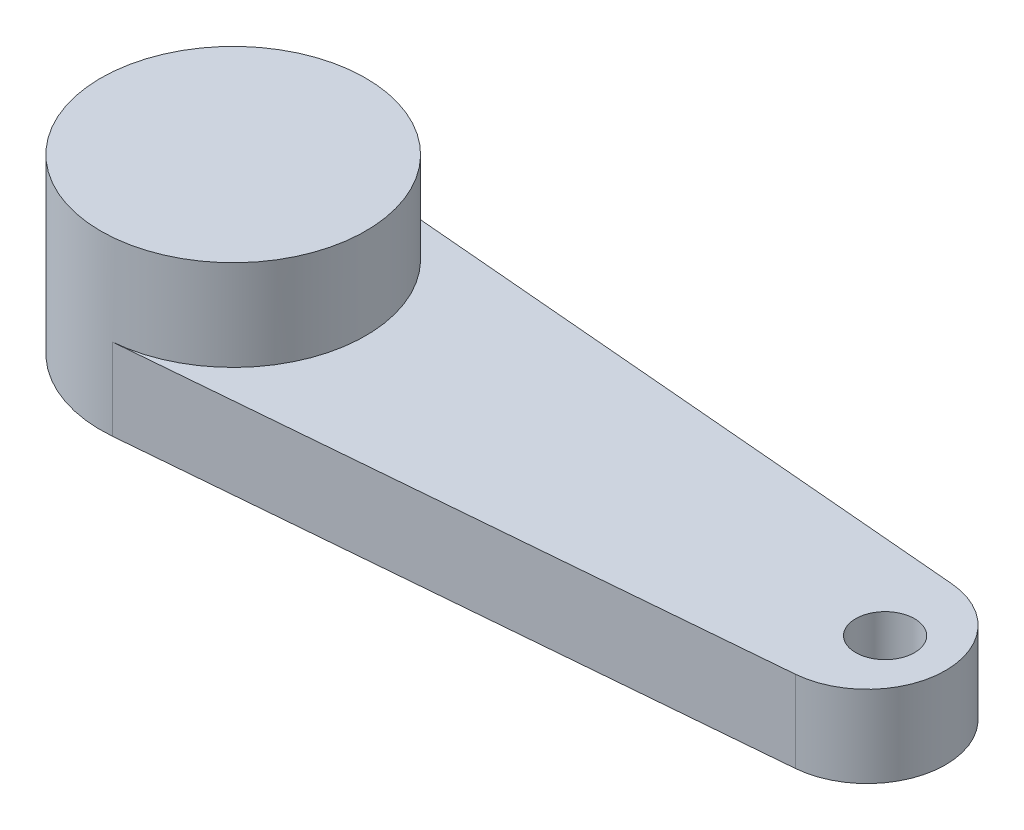
ISO-10303-21;
HEADER;
FILE_DESCRIPTION(('STEP AP214'),'2;1');
FILE_NAME('part.step','',(''),(''),'','','');
FILE_SCHEMA(('AUTOMOTIVE_DESIGN { 1 0 10303 214 1 1 1 1 }'));
ENDSEC;
DATA;
#1=APPLICATION_CONTEXT('core data for automotive mechanical design processes');
#2=APPLICATION_PROTOCOL_DEFINITION('international standard','automotive_design',2000,#1);
#3=PRODUCT_CONTEXT('',#1,'mechanical');
#4=PRODUCT('Part','Part','',(#3));
#5=PRODUCT_RELATED_PRODUCT_CATEGORY('part','',(#4));
#6=PRODUCT_DEFINITION_FORMATION('','',#4);
#7=PRODUCT_DEFINITION_CONTEXT('part definition',#1,'design');
#8=PRODUCT_DEFINITION('design','',#6,#7);
#9=PRODUCT_DEFINITION_SHAPE('','',#8);
#10=(LENGTH_UNIT() NAMED_UNIT(*) SI_UNIT(.MILLI.,.METRE.));
#11=(NAMED_UNIT(*) PLANE_ANGLE_UNIT() SI_UNIT($,.RADIAN.));
#12=(NAMED_UNIT(*) SI_UNIT($,.STERADIAN.) SOLID_ANGLE_UNIT());
#13=UNCERTAINTY_MEASURE_WITH_UNIT(LENGTH_MEASURE(1.E-05),#10,'distance_accuracy_value','');
#14=(GEOMETRIC_REPRESENTATION_CONTEXT(3) GLOBAL_UNCERTAINTY_ASSIGNED_CONTEXT((#13)) GLOBAL_UNIT_ASSIGNED_CONTEXT((#10,
#11,#12)) REPRESENTATION_CONTEXT('',''));
#15=CARTESIAN_POINT('',(0.,0.,0.));
#16=DIRECTION('',(0.,0.,1.));
#17=DIRECTION('',(1.,0.,0.));
#18=AXIS2_PLACEMENT_3D('',#15,#16,#17);
#19=CARTESIAN_POINT('',(0.28743419015175,2.08,3.36273795980772));
#20=DIRECTION('',(0.0851656859708888,0.,0.996366802905992));
#21=DIRECTION('',(0.996366802905992,0.,-0.0851656859708888));
#22=AXIS2_PLACEMENT_3D('',#19,#20,#21);
#23=PLANE('',#22);
#24=DIRECTION('',(-0.996366802905992,0.,0.0851656859708888));
#25=VECTOR('',#24,1.);
#26=CARTESIAN_POINT('',(0.28743419015175,0.,3.36273795980772));
#27=LINE('',#26,#25);
#28=CARTESIAN_POINT('',(16.3153313719418,0.,1.99273360581198));
#29=VERTEX_POINT('',#28);
#30=CARTESIAN_POINT('',(0.28743419015175,0.,3.36273795980772));
#31=VERTEX_POINT('',#30);
#32=EDGE_CURVE('E127',#29,#31,#27,.T.);
#33=ORIENTED_EDGE('',*,*,#32,.F.);
#34=DIRECTION('',(0.,-1.,0.));
#35=VECTOR('',#34,1.);
#36=CARTESIAN_POINT('',(16.3153313719418,2.08,1.99273360581198));
#37=LINE('',#36,#35);
#38=CARTESIAN_POINT('',(16.3153313719418,2.08,1.99273360581198));
#39=VERTEX_POINT('',#38);
#40=EDGE_CURVE('E11',#39,#29,#37,.T.);
#41=ORIENTED_EDGE('',*,*,#40,.F.);
#42=DIRECTION('',(-0.996366802905992,0.,0.0851656859708888));
#43=VECTOR('',#42,1.);
#44=CARTESIAN_POINT('',(0.28743419015175,2.08,3.36273795980772));
#45=LINE('',#44,#43);
#46=CARTESIAN_POINT('',(0.28743419015175,2.08,3.36273795980772));
#47=VERTEX_POINT('',#46);
#48=EDGE_CURVE('E86',#39,#47,#45,.T.);
#49=ORIENTED_EDGE('',*,*,#48,.T.);
#50=DIRECTION('',(0.,-1.,0.));
#51=VECTOR('',#50,1.);
#52=CARTESIAN_POINT('',(0.28743419015175,2.08,3.36273795980772));
#53=LINE('',#52,#51);
#54=EDGE_CURVE('E81',#47,#31,#53,.T.);
#55=ORIENTED_EDGE('',*,*,#54,.T.);
#56=EDGE_LOOP('',(#33,#41,#49,#55));
#57=FACE_BOUND('',#56,.T.);
#58=ADVANCED_FACE('F41',(#57),#23,.T.);
#59=CARTESIAN_POINT('',(16.145,2.08,0.));
#60=DIRECTION('',(0.,-1.,0.));
#61=DIRECTION('',(0.,0.,-1.));
#62=AXIS2_PLACEMENT_3D('',#59,#60,#61);
#63=CYLINDRICAL_SURFACE('',#62,2.);
#64=CARTESIAN_POINT('',(16.145,0.,0.));
#65=DIRECTION('',(0.,1.,0.));
#66=DIRECTION('',(0.,0.,1.));
#67=AXIS2_PLACEMENT_3D('',#64,#65,#66);
#68=CIRCLE('',#67,2.);
#69=CARTESIAN_POINT('',(16.3153313719418,0.,-1.99273360581198));
#70=VERTEX_POINT('',#69);
#71=EDGE_CURVE('E130',#29,#70,#68,.T.);
#72=ORIENTED_EDGE('',*,*,#71,.T.);
#73=DIRECTION('',(0.,-1.,0.));
#74=VECTOR('',#73,1.);
#75=CARTESIAN_POINT('',(16.3153313719418,2.08,-1.99273360581198));
#76=LINE('',#75,#74);
#77=CARTESIAN_POINT('',(16.3153313719418,2.08,-1.99273360581198));
#78=VERTEX_POINT('',#77);
#79=EDGE_CURVE('E51',#78,#70,#76,.T.);
#80=ORIENTED_EDGE('',*,*,#79,.F.);
#81=CARTESIAN_POINT('',(16.145,2.08,0.));
#82=DIRECTION('',(0.,1.,0.));
#83=DIRECTION('',(0.,0.,1.));
#84=AXIS2_PLACEMENT_3D('',#81,#82,#83);
#85=CIRCLE('',#84,2.);
#86=EDGE_CURVE('E90',#39,#78,#85,.T.);
#87=ORIENTED_EDGE('',*,*,#86,.F.);
#88=ORIENTED_EDGE('',*,*,#40,.T.);
#89=EDGE_LOOP('',(#72,#80,#87,#88));
#90=FACE_BOUND('',#89,.T.);
#91=ADVANCED_FACE('F146',(#90),#63,.T.);
#92=CARTESIAN_POINT('',(0.28743419015175,2.08,-3.36273795980772));
#93=DIRECTION('',(0.0851656859708888,0.,-0.996366802905992));
#94=DIRECTION('',(-0.996366802905992,0.,-0.0851656859708888));
#95=AXIS2_PLACEMENT_3D('',#92,#93,#94);
#96=PLANE('',#95);
#97=DIRECTION('',(0.996366802905992,0.,0.0851656859708888));
#98=VECTOR('',#97,1.);
#99=CARTESIAN_POINT('',(0.28743419015175,0.,-3.36273795980772));
#100=LINE('',#99,#98);
#101=CARTESIAN_POINT('',(0.28743419015175,0.,-3.36273795980772));
#102=VERTEX_POINT('',#101);
#103=EDGE_CURVE('E134',#102,#70,#100,.T.);
#104=ORIENTED_EDGE('',*,*,#103,.F.);
#105=DIRECTION('',(0.,-1.,0.));
#106=VECTOR('',#105,1.);
#107=CARTESIAN_POINT('',(0.28743419015175,2.08,-3.36273795980772));
#108=LINE('',#107,#106);
#109=CARTESIAN_POINT('',(0.28743419015175,2.08,-3.36273795980772));
#110=VERTEX_POINT('',#109);
#111=EDGE_CURVE('E59',#110,#102,#108,.T.);
#112=ORIENTED_EDGE('',*,*,#111,.F.);
#113=DIRECTION('',(0.996366802905992,0.,0.0851656859708888));
#114=VECTOR('',#113,1.);
#115=CARTESIAN_POINT('',(0.28743419015175,2.08,-3.36273795980772));
#116=LINE('',#115,#114);
#117=EDGE_CURVE('E99',#110,#78,#116,.T.);
#118=ORIENTED_EDGE('',*,*,#117,.T.);
#119=ORIENTED_EDGE('',*,*,#79,.T.);
#120=EDGE_LOOP('',(#104,#112,#118,#119));
#121=FACE_BOUND('',#120,.T.);
#122=ADVANCED_FACE('F143',(#121),#96,.T.);
#123=CARTESIAN_POINT('',(16.605,2.08,0.));
#124=DIRECTION('',(0.,-1.,0.));
#125=DIRECTION('',(0.,0.,-1.));
#126=AXIS2_PLACEMENT_3D('',#123,#124,#125);
#127=CYLINDRICAL_SURFACE('',#126,0.750000000000002);
#128=CARTESIAN_POINT('',(16.605,2.08,0.));
#129=DIRECTION('',(0.,1.,0.));
#130=DIRECTION('',(0.,0.,1.));
#131=AXIS2_PLACEMENT_3D('',#128,#129,#130);
#132=CIRCLE('',#131,0.750000000000002);
#133=CARTESIAN_POINT('',(16.605,2.08,0.750000000000002));
#134=VERTEX_POINT('',#133);
#135=EDGE_CURVE('E91',#134,#134,#132,.T.);
#136=ORIENTED_EDGE('',*,*,#135,.T.);
#137=EDGE_LOOP('',(#136));
#138=FACE_BOUND('',#137,.T.);
#139=CARTESIAN_POINT('',(16.605,0.,0.));
#140=DIRECTION('',(0.,1.,0.));
#141=DIRECTION('',(0.,0.,1.));
#142=AXIS2_PLACEMENT_3D('',#139,#140,#141);
#143=CIRCLE('',#142,0.750000000000002);
#144=CARTESIAN_POINT('',(16.605,0.,0.750000000000002));
#145=VERTEX_POINT('',#144);
#146=EDGE_CURVE('E110',#145,#145,#143,.T.);
#147=ORIENTED_EDGE('',*,*,#146,.F.);
#148=EDGE_LOOP('',(#147));
#149=FACE_BOUND('',#148,.T.);
#150=ADVANCED_FACE('F43',(#138,#149),#127,.F.);
#151=CARTESIAN_POINT('',(0.,2.08,0.));
#152=DIRECTION('',(0.,-1.,0.));
#153=DIRECTION('',(0.,0.,-1.));
#154=AXIS2_PLACEMENT_3D('',#151,#152,#153);
#155=CYLINDRICAL_SURFACE('',#154,3.375);
#156=CARTESIAN_POINT('',(0.,0.,0.));
#157=DIRECTION('',(0.,1.,0.));
#158=DIRECTION('',(0.,0.,1.));
#159=AXIS2_PLACEMENT_3D('',#156,#157,#158);
#160=CIRCLE('',#159,3.375);
#161=EDGE_CURVE('E96',#102,#31,#160,.T.);
#162=ORIENTED_EDGE('',*,*,#161,.T.);
#163=ORIENTED_EDGE('',*,*,#54,.F.);
#164=CARTESIAN_POINT('',(0.,2.08,0.));
#165=DIRECTION('',(0.,1.,0.));
#166=DIRECTION('',(0.,0.,1.));
#167=AXIS2_PLACEMENT_3D('',#164,#165,#166);
#168=CIRCLE('',#167,3.375);
#169=EDGE_CURVE('E95',#47,#110,#168,.T.);
#170=ORIENTED_EDGE('',*,*,#169,.T.);
#171=ORIENTED_EDGE('',*,*,#111,.T.);
#172=EDGE_LOOP('',(#162,#163,#170,#171));
#173=FACE_BOUND('',#172,.T.);
#174=CARTESIAN_POINT('',(0.,4.39,0.));
#175=DIRECTION('',(0.,1.,0.));
#176=DIRECTION('',(0.,0.,1.));
#177=AXIS2_PLACEMENT_3D('',#174,#175,#176);
#178=CIRCLE('',#177,3.375);
#179=CARTESIAN_POINT('',(0.,4.39,3.375));
#180=VERTEX_POINT('',#179);
#181=EDGE_CURVE('E104',#180,#180,#178,.T.);
#182=ORIENTED_EDGE('',*,*,#181,.F.);
#183=EDGE_LOOP('',(#182));
#184=FACE_BOUND('',#183,.T.);
#185=ADVANCED_FACE('F93',(#173,#184),#155,.T.);
#186=CARTESIAN_POINT('',(0.,2.08,0.));
#187=DIRECTION('',(0.,1.,0.));
#188=DIRECTION('',(0.,0.,1.));
#189=AXIS2_PLACEMENT_3D('',#186,#187,#188);
#190=PLANE('',#189);
#191=ORIENTED_EDGE('',*,*,#169,.F.);
#192=ORIENTED_EDGE('',*,*,#48,.F.);
#193=ORIENTED_EDGE('',*,*,#86,.T.);
#194=ORIENTED_EDGE('',*,*,#117,.F.);
#195=EDGE_LOOP('',(#191,#192,#193,#194));
#196=FACE_BOUND('',#195,.T.);
#197=ORIENTED_EDGE('',*,*,#135,.F.);
#198=EDGE_LOOP('',(#197));
#199=FACE_BOUND('',#198,.T.);
#200=ADVANCED_FACE('F101',(#196,#199),#190,.T.);
#201=CARTESIAN_POINT('',(0.,0.,0.));
#202=DIRECTION('',(0.,1.,0.));
#203=DIRECTION('',(0.,0.,1.));
#204=AXIS2_PLACEMENT_3D('',#201,#202,#203);
#205=PLANE('',#204);
#206=CARTESIAN_POINT('',(0.,0.,0.));
#207=DIRECTION('',(0.,1.,0.));
#208=DIRECTION('',(0.,0.,1.));
#209=AXIS2_PLACEMENT_3D('',#206,#207,#208);
#210=CIRCLE('',#209,2.25);
#211=CARTESIAN_POINT('',(0.,0.,2.25));
#212=VERTEX_POINT('',#211);
#213=EDGE_CURVE('E113',#212,#212,#210,.T.);
#214=ORIENTED_EDGE('',*,*,#213,.T.);
#215=EDGE_LOOP('',(#214));
#216=FACE_BOUND('',#215,.T.);
#217=ORIENTED_EDGE('',*,*,#146,.T.);
#218=EDGE_LOOP('',(#217));
#219=FACE_BOUND('',#218,.T.);
#220=ORIENTED_EDGE('',*,*,#32,.T.);
#221=ORIENTED_EDGE('',*,*,#161,.F.);
#222=ORIENTED_EDGE('',*,*,#103,.T.);
#223=ORIENTED_EDGE('',*,*,#71,.F.);
#224=EDGE_LOOP('',(#220,#221,#222,#223));
#225=FACE_BOUND('',#224,.T.);
#226=ADVANCED_FACE('F148',(#216,#219,#225),#205,.F.);
#227=CARTESIAN_POINT('',(0.,4.39,0.));
#228=DIRECTION('',(0.,1.,0.));
#229=DIRECTION('',(0.,0.,1.));
#230=AXIS2_PLACEMENT_3D('',#227,#228,#229);
#231=PLANE('',#230);
#232=ORIENTED_EDGE('',*,*,#181,.T.);
#233=EDGE_LOOP('',(#232));
#234=FACE_BOUND('',#233,.T.);
#235=ADVANCED_FACE('F150',(#234),#231,.T.);
#236=CARTESIAN_POINT('',(0.,0.84,0.));
#237=DIRECTION('',(0.,-1.,0.));
#238=DIRECTION('',(0.,0.,-1.));
#239=AXIS2_PLACEMENT_3D('',#236,#237,#238);
#240=CYLINDRICAL_SURFACE('',#239,2.25);
#241=CARTESIAN_POINT('',(0.,0.84,0.));
#242=DIRECTION('',(0.,1.,0.));
#243=DIRECTION('',(0.,0.,1.));
#244=AXIS2_PLACEMENT_3D('',#241,#242,#243);
#245=CIRCLE('',#244,2.25);
#246=CARTESIAN_POINT('',(0.,0.84,2.25));
#247=VERTEX_POINT('',#246);
#248=EDGE_CURVE('E105',#247,#247,#245,.T.);
#249=ORIENTED_EDGE('',*,*,#248,.T.);
#250=EDGE_LOOP('',(#249));
#251=FACE_BOUND('',#250,.T.);
#252=ORIENTED_EDGE('',*,*,#213,.F.);
#253=EDGE_LOOP('',(#252));
#254=FACE_BOUND('',#253,.T.);
#255=ADVANCED_FACE('F157',(#251,#254),#240,.F.);
#256=CARTESIAN_POINT('',(0.,0.84,0.));
#257=DIRECTION('',(0.,1.,0.));
#258=DIRECTION('',(0.,0.,1.));
#259=AXIS2_PLACEMENT_3D('',#256,#257,#258);
#260=PLANE('',#259);
#261=ORIENTED_EDGE('',*,*,#248,.F.);
#262=EDGE_LOOP('',(#261));
#263=FACE_BOUND('',#262,.T.);
#264=ADVANCED_FACE('F224',(#263),#260,.F.);
#265=CLOSED_SHELL('',(#58,#91,#122,#150,#185,#200,#226,#235,#255,#264));
#266=MANIFOLD_SOLID_BREP('B2',#265);
#267=ADVANCED_BREP_SHAPE_REPRESENTATION('',(#18,#266),#14);
#268=SHAPE_DEFINITION_REPRESENTATION(#9,#267);
ENDSEC;
END-ISO-10303-21;
